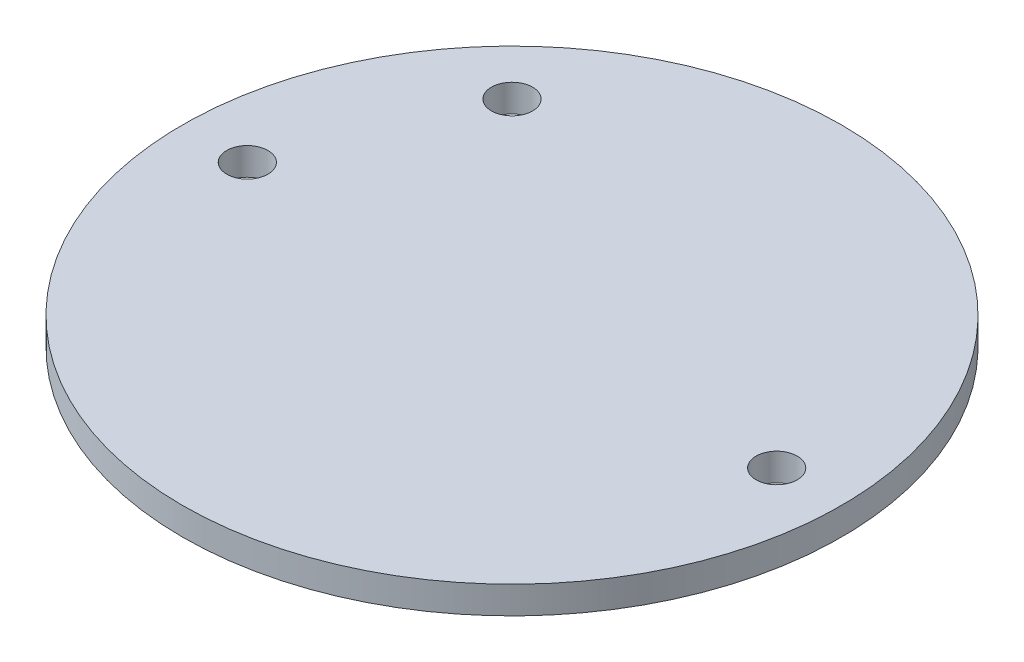
ISO-10303-21;
HEADER;
FILE_DESCRIPTION(('STEP AP214'),'2;1');
FILE_NAME('part.step','',(''),(''),'','','');
FILE_SCHEMA(('AUTOMOTIVE_DESIGN { 1 0 10303 214 1 1 1 1 }'));
ENDSEC;
DATA;
#1=APPLICATION_CONTEXT('core data for automotive mechanical design processes');
#2=APPLICATION_PROTOCOL_DEFINITION('international standard','automotive_design',2000,#1);
#3=PRODUCT_CONTEXT('',#1,'mechanical');
#4=PRODUCT('Part','Part','',(#3));
#5=PRODUCT_RELATED_PRODUCT_CATEGORY('part','',(#4));
#6=PRODUCT_DEFINITION_FORMATION('','',#4);
#7=PRODUCT_DEFINITION_CONTEXT('part definition',#1,'design');
#8=PRODUCT_DEFINITION('design','',#6,#7);
#9=PRODUCT_DEFINITION_SHAPE('','',#8);
#10=(LENGTH_UNIT() NAMED_UNIT(*) SI_UNIT(.MILLI.,.METRE.));
#11=(NAMED_UNIT(*) PLANE_ANGLE_UNIT() SI_UNIT($,.RADIAN.));
#12=(NAMED_UNIT(*) SI_UNIT($,.STERADIAN.) SOLID_ANGLE_UNIT());
#13=UNCERTAINTY_MEASURE_WITH_UNIT(LENGTH_MEASURE(1.E-05),#10,'distance_accuracy_value','');
#14=(GEOMETRIC_REPRESENTATION_CONTEXT(3) GLOBAL_UNCERTAINTY_ASSIGNED_CONTEXT((#13)) GLOBAL_UNIT_ASSIGNED_CONTEXT((#10,
#11,#12)) REPRESENTATION_CONTEXT('',''));
#15=CARTESIAN_POINT('',(0.,0.,0.));
#16=DIRECTION('',(0.,0.,1.));
#17=DIRECTION('',(1.,0.,0.));
#18=AXIS2_PLACEMENT_3D('',#15,#16,#17);
#19=CARTESIAN_POINT('',(19.275,2.,0.));
#20=DIRECTION('',(0.,-1.,0.));
#21=DIRECTION('',(0.,0.,-1.));
#22=AXIS2_PLACEMENT_3D('',#19,#20,#21);
#23=CYLINDRICAL_SURFACE('',#22,1.5);
#24=CARTESIAN_POINT('',(19.275,2.,0.));
#25=DIRECTION('',(0.,1.,0.));
#26=DIRECTION('',(0.,0.,1.));
#27=AXIS2_PLACEMENT_3D('',#24,#25,#26);
#28=CIRCLE('',#27,1.5);
#29=CARTESIAN_POINT('',(19.275,2.,1.5));
#30=VERTEX_POINT('',#29);
#31=EDGE_CURVE('E52',#30,#30,#28,.T.);
#32=ORIENTED_EDGE('',*,*,#31,.T.);
#33=EDGE_LOOP('',(#32));
#34=FACE_BOUND('',#33,.T.);
#35=CARTESIAN_POINT('',(19.275,0.,0.));
#36=DIRECTION('',(0.,1.,0.));
#37=DIRECTION('',(0.,0.,1.));
#38=AXIS2_PLACEMENT_3D('',#35,#36,#37);
#39=CIRCLE('',#38,1.5);
#40=CARTESIAN_POINT('',(19.275,0.,1.5));
#41=VERTEX_POINT('',#40);
#42=EDGE_CURVE('E69',#41,#41,#39,.T.);
#43=ORIENTED_EDGE('',*,*,#42,.F.);
#44=EDGE_LOOP('',(#43));
#45=FACE_BOUND('',#44,.T.);
#46=ADVANCED_FACE('F43',(#34,#45),#23,.F.);
#47=CARTESIAN_POINT('',(0.,2.,0.));
#48=DIRECTION('',(0.,-1.,0.));
#49=DIRECTION('',(0.,0.,-1.));
#50=AXIS2_PLACEMENT_3D('',#47,#48,#49);
#51=CYLINDRICAL_SURFACE('',#50,24.);
#52=CARTESIAN_POINT('',(0.,2.,0.));
#53=DIRECTION('',(0.,1.,0.));
#54=DIRECTION('',(0.,0.,1.));
#55=AXIS2_PLACEMENT_3D('',#52,#53,#54);
#56=CIRCLE('',#55,24.);
#57=CARTESIAN_POINT('',(0.,2.,24.));
#58=VERTEX_POINT('',#57);
#59=EDGE_CURVE('E58',#58,#58,#56,.T.);
#60=ORIENTED_EDGE('',*,*,#59,.F.);
#61=EDGE_LOOP('',(#60));
#62=FACE_BOUND('',#61,.T.);
#63=CARTESIAN_POINT('',(0.,0.,0.));
#64=DIRECTION('',(0.,1.,0.));
#65=DIRECTION('',(0.,0.,1.));
#66=AXIS2_PLACEMENT_3D('',#63,#64,#65);
#67=CIRCLE('',#66,24.);
#68=CARTESIAN_POINT('',(0.,0.,24.));
#69=VERTEX_POINT('',#68);
#70=EDGE_CURVE('E66',#69,#69,#67,.T.);
#71=ORIENTED_EDGE('',*,*,#70,.T.);
#72=EDGE_LOOP('',(#71));
#73=FACE_BOUND('',#72,.T.);
#74=ADVANCED_FACE('F91',(#62,#73),#51,.T.);
#75=CARTESIAN_POINT('',(-13.6294832073707,2.,-13.6294832073707));
#76=DIRECTION('',(0.,-1.,0.));
#77=DIRECTION('',(0.,0.,-1.));
#78=AXIS2_PLACEMENT_3D('',#75,#76,#77);
#79=CYLINDRICAL_SURFACE('',#78,1.5);
#80=CARTESIAN_POINT('',(-13.6294832073707,2.,-13.6294832073707));
#81=DIRECTION('',(0.,1.,0.));
#82=DIRECTION('',(0.,0.,1.));
#83=AXIS2_PLACEMENT_3D('',#80,#81,#82);
#84=CIRCLE('',#83,1.5);
#85=CARTESIAN_POINT('',(-13.6294832073707,2.,-12.1294832073707));
#86=VERTEX_POINT('',#85);
#87=EDGE_CURVE('E76',#86,#86,#84,.T.);
#88=ORIENTED_EDGE('',*,*,#87,.T.);
#89=EDGE_LOOP('',(#88));
#90=FACE_BOUND('',#89,.T.);
#91=CARTESIAN_POINT('',(-13.6294832073707,0.,-13.6294832073707));
#92=DIRECTION('',(0.,1.,0.));
#93=DIRECTION('',(0.,0.,1.));
#94=AXIS2_PLACEMENT_3D('',#91,#92,#93);
#95=CIRCLE('',#94,1.5);
#96=CARTESIAN_POINT('',(-13.6294832073707,0.,-12.1294832073707));
#97=VERTEX_POINT('',#96);
#98=EDGE_CURVE('E62',#97,#97,#95,.T.);
#99=ORIENTED_EDGE('',*,*,#98,.F.);
#100=EDGE_LOOP('',(#99));
#101=FACE_BOUND('',#100,.T.);
#102=ADVANCED_FACE('F45',(#90,#101),#79,.F.);
#103=CARTESIAN_POINT('',(-19.275,2.,0.));
#104=DIRECTION('',(0.,-1.,0.));
#105=DIRECTION('',(0.,0.,-1.));
#106=AXIS2_PLACEMENT_3D('',#103,#104,#105);
#107=CYLINDRICAL_SURFACE('',#106,1.5);
#108=CARTESIAN_POINT('',(-19.275,2.,0.));
#109=DIRECTION('',(0.,1.,0.));
#110=DIRECTION('',(0.,0.,1.));
#111=AXIS2_PLACEMENT_3D('',#108,#109,#110);
#112=CIRCLE('',#111,1.5);
#113=CARTESIAN_POINT('',(-19.275,2.,1.5));
#114=VERTEX_POINT('',#113);
#115=EDGE_CURVE('E10',#114,#114,#112,.T.);
#116=ORIENTED_EDGE('',*,*,#115,.T.);
#117=EDGE_LOOP('',(#116));
#118=FACE_BOUND('',#117,.T.);
#119=CARTESIAN_POINT('',(-19.275,0.,0.));
#120=DIRECTION('',(0.,1.,0.));
#121=DIRECTION('',(0.,0.,1.));
#122=AXIS2_PLACEMENT_3D('',#119,#120,#121);
#123=CIRCLE('',#122,1.5);
#124=CARTESIAN_POINT('',(-19.275,0.,1.5));
#125=VERTEX_POINT('',#124);
#126=EDGE_CURVE('E47',#125,#125,#123,.T.);
#127=ORIENTED_EDGE('',*,*,#126,.F.);
#128=EDGE_LOOP('',(#127));
#129=FACE_BOUND('',#128,.T.);
#130=ADVANCED_FACE('F103',(#118,#129),#107,.F.);
#131=CARTESIAN_POINT('',(0.,2.,0.));
#132=DIRECTION('',(0.,1.,0.));
#133=DIRECTION('',(0.,0.,1.));
#134=AXIS2_PLACEMENT_3D('',#131,#132,#133);
#135=PLANE('',#134);
#136=ORIENTED_EDGE('',*,*,#87,.F.);
#137=EDGE_LOOP('',(#136));
#138=FACE_BOUND('',#137,.T.);
#139=ORIENTED_EDGE('',*,*,#59,.T.);
#140=EDGE_LOOP('',(#139));
#141=FACE_BOUND('',#140,.T.);
#142=ORIENTED_EDGE('',*,*,#31,.F.);
#143=EDGE_LOOP('',(#142));
#144=FACE_BOUND('',#143,.T.);
#145=ORIENTED_EDGE('',*,*,#115,.F.);
#146=EDGE_LOOP('',(#145));
#147=FACE_BOUND('',#146,.T.);
#148=ADVANCED_FACE('F88',(#138,#141,#144,#147),#135,.T.);
#149=CARTESIAN_POINT('',(0.,0.,0.));
#150=DIRECTION('',(0.,1.,0.));
#151=DIRECTION('',(0.,0.,1.));
#152=AXIS2_PLACEMENT_3D('',#149,#150,#151);
#153=PLANE('',#152);
#154=ORIENTED_EDGE('',*,*,#98,.T.);
#155=EDGE_LOOP('',(#154));
#156=FACE_BOUND('',#155,.T.);
#157=ORIENTED_EDGE('',*,*,#70,.F.);
#158=EDGE_LOOP('',(#157));
#159=FACE_BOUND('',#158,.T.);
#160=ORIENTED_EDGE('',*,*,#42,.T.);
#161=EDGE_LOOP('',(#160));
#162=FACE_BOUND('',#161,.T.);
#163=ORIENTED_EDGE('',*,*,#126,.T.);
#164=EDGE_LOOP('',(#163));
#165=FACE_BOUND('',#164,.T.);
#166=ADVANCED_FACE('F96',(#156,#159,#162,#165),#153,.F.);
#167=CLOSED_SHELL('',(#46,#74,#102,#130,#148,#166));
#168=MANIFOLD_SOLID_BREP('B2',#167);
#169=ADVANCED_BREP_SHAPE_REPRESENTATION('',(#18,#168),#14);
#170=SHAPE_DEFINITION_REPRESENTATION(#9,#169);
ENDSEC;
END-ISO-10303-21;
